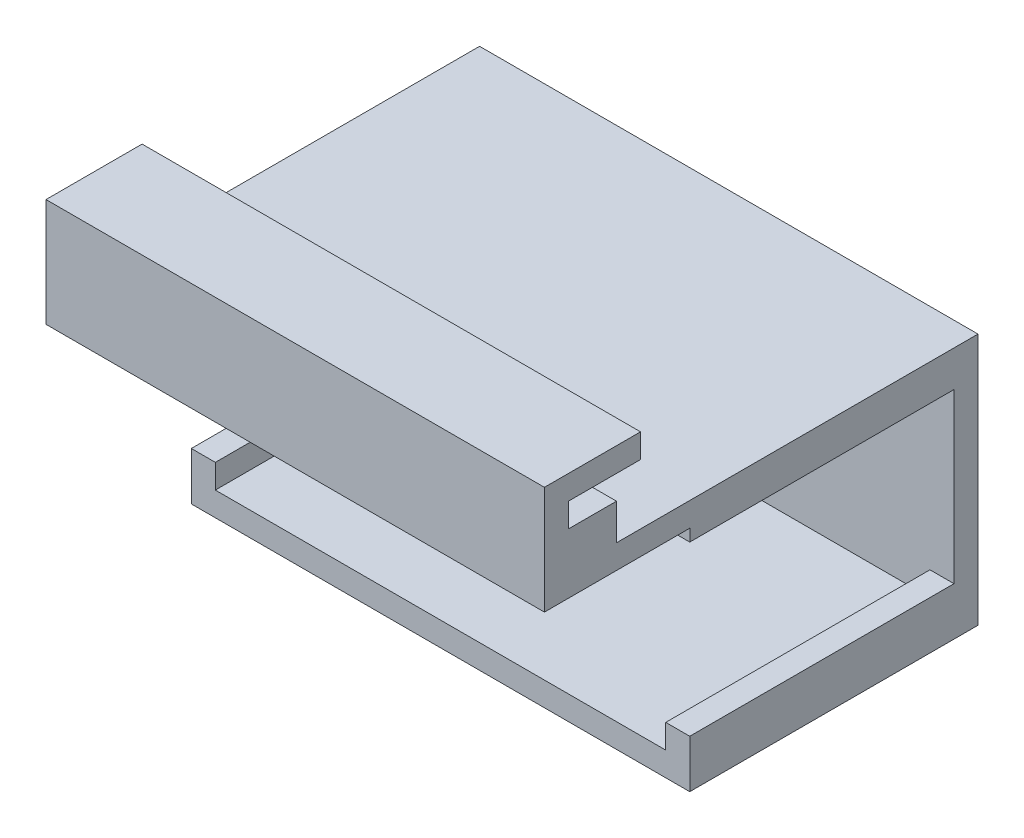
ISO-10303-21;
HEADER;
FILE_DESCRIPTION(('STEP AP214'),'2;1');
FILE_NAME('part.step','',(''),(''),'','','');
FILE_SCHEMA(('AUTOMOTIVE_DESIGN { 1 0 10303 214 1 1 1 1 }'));
ENDSEC;
DATA;
#1=APPLICATION_CONTEXT('core data for automotive mechanical design processes');
#2=APPLICATION_PROTOCOL_DEFINITION('international standard','automotive_design',2000,#1);
#3=PRODUCT_CONTEXT('',#1,'mechanical');
#4=PRODUCT('Part','Part','',(#3));
#5=PRODUCT_RELATED_PRODUCT_CATEGORY('part','',(#4));
#6=PRODUCT_DEFINITION_FORMATION('','',#4);
#7=PRODUCT_DEFINITION_CONTEXT('part definition',#1,'design');
#8=PRODUCT_DEFINITION('design','',#6,#7);
#9=PRODUCT_DEFINITION_SHAPE('','',#8);
#10=(LENGTH_UNIT() NAMED_UNIT(*) SI_UNIT(.MILLI.,.METRE.));
#11=(NAMED_UNIT(*) PLANE_ANGLE_UNIT() SI_UNIT($,.RADIAN.));
#12=(NAMED_UNIT(*) SI_UNIT($,.STERADIAN.) SOLID_ANGLE_UNIT());
#13=UNCERTAINTY_MEASURE_WITH_UNIT(LENGTH_MEASURE(1.E-05),#10,'distance_accuracy_value','');
#14=(GEOMETRIC_REPRESENTATION_CONTEXT(3) GLOBAL_UNCERTAINTY_ASSIGNED_CONTEXT((#13)) GLOBAL_UNIT_ASSIGNED_CONTEXT((#10,
#11,#12)) REPRESENTATION_CONTEXT('',''));
#15=CARTESIAN_POINT('',(0.,0.,0.));
#16=DIRECTION('',(0.,0.,1.));
#17=DIRECTION('',(1.,0.,0.));
#18=AXIS2_PLACEMENT_3D('',#15,#16,#17);
#19=CARTESIAN_POINT('',(-48.9395510953457,26.5034566253615,2.));
#20=DIRECTION('',(0.,-1.,0.));
#21=DIRECTION('',(0.,0.,-1.));
#22=AXIS2_PLACEMENT_3D('',#19,#20,#21);
#23=PLANE('',#22);
#24=DIRECTION('',(1.,0.,0.));
#25=VECTOR('',#24,1.);
#26=CARTESIAN_POINT('',(-49.9395510953457,26.5034566253615,30.1));
#27=LINE('',#26,#25);
#28=CARTESIAN_POINT('',(-49.9395510953457,26.5034566253615,30.1));
#29=VERTEX_POINT('',#28);
#30=CARTESIAN_POINT('',(-8.43955109534567,26.5034566253615,30.1));
#31=VERTEX_POINT('',#30);
#32=EDGE_CURVE('E211',#29,#31,#27,.T.);
#33=ORIENTED_EDGE('',*,*,#32,.T.);
#34=DIRECTION('',(0.,0.,-1.));
#35=VECTOR('',#34,1.);
#36=CARTESIAN_POINT('',(-8.43955109534567,26.5034566253615,2.));
#37=LINE('',#36,#35);
#38=CARTESIAN_POINT('',(-8.43955109534567,26.5034566253615,0.));
#39=VERTEX_POINT('',#38);
#40=EDGE_CURVE('E356',#31,#39,#37,.T.);
#41=ORIENTED_EDGE('',*,*,#40,.T.);
#42=DIRECTION('',(-1.,0.,0.));
#43=VECTOR('',#42,1.);
#44=CARTESIAN_POINT('',(-48.9395510953457,26.5034566253615,0.));
#45=LINE('',#44,#43);
#46=CARTESIAN_POINT('',(-49.9395510953457,26.5034566253615,0.));
#47=VERTEX_POINT('',#46);
#48=EDGE_CURVE('E353',#39,#47,#45,.T.);
#49=ORIENTED_EDGE('',*,*,#48,.T.);
#50=DIRECTION('',(0.,0.,-1.));
#51=VECTOR('',#50,1.);
#52=CARTESIAN_POINT('',(-49.9395510953457,26.5034566253615,2.));
#53=LINE('',#52,#51);
#54=EDGE_CURVE('E364',#29,#47,#53,.T.);
#55=ORIENTED_EDGE('',*,*,#54,.F.);
#56=EDGE_LOOP('',(#33,#41,#49,#55));
#57=FACE_BOUND('',#56,.T.);
#58=ADVANCED_FACE('F32',(#57),#23,.F.);
#59=CARTESIAN_POINT('',(0.,0.,24.));
#60=DIRECTION('',(0.,0.,1.));
#61=DIRECTION('',(1.,0.,0.));
#62=AXIS2_PLACEMENT_3D('',#59,#60,#61);
#63=PLANE('',#62);
#64=DIRECTION('',(0.,1.,0.));
#65=VECTOR('',#64,1.);
#66=CARTESIAN_POINT('',(-8.43955109534567,6.50345662536146,24.));
#67=LINE('',#66,#65);
#68=CARTESIAN_POINT('',(-8.43955109534567,23.5034566253615,24.));
#69=VERTEX_POINT('',#68);
#70=CARTESIAN_POINT('',(-8.43955109534567,24.5034566253615,24.));
#71=VERTEX_POINT('',#70);
#72=EDGE_CURVE('E326',#69,#71,#67,.T.);
#73=ORIENTED_EDGE('',*,*,#72,.T.);
#74=DIRECTION('',(-1.,0.,0.));
#75=VECTOR('',#74,1.);
#76=CARTESIAN_POINT('',(0.,24.5034566253615,24.));
#77=LINE('',#76,#75);
#78=CARTESIAN_POINT('',(-10.4395510953457,24.5034566253615,24.));
#79=VERTEX_POINT('',#78);
#80=EDGE_CURVE('E258',#71,#79,#77,.T.);
#81=ORIENTED_EDGE('',*,*,#80,.T.);
#82=DIRECTION('',(0.,1.,0.));
#83=VECTOR('',#82,1.);
#84=CARTESIAN_POINT('',(-10.4395510953457,8.50345662536146,24.));
#85=LINE('',#84,#83);
#86=CARTESIAN_POINT('',(-10.4395510953457,23.5034566253615,24.));
#87=VERTEX_POINT('',#86);
#88=EDGE_CURVE('E306',#87,#79,#85,.T.);
#89=ORIENTED_EDGE('',*,*,#88,.F.);
#90=DIRECTION('',(-1.,0.,0.));
#91=VECTOR('',#90,1.);
#92=CARTESIAN_POINT('',(0.,23.5034566253615,24.));
#93=LINE('',#92,#91);
#94=EDGE_CURVE('E283',#69,#87,#93,.T.);
#95=ORIENTED_EDGE('',*,*,#94,.F.);
#96=EDGE_LOOP('',(#73,#81,#89,#95));
#97=FACE_BOUND('',#96,.T.);
#98=ADVANCED_FACE('F394',(#97),#63,.T.);
#99=DIRECTION('',(0.,-1.,0.));
#100=VECTOR('',#99,1.);
#101=CARTESIAN_POINT('',(-47.9395510953457,7.50345662536146,24.));
#102=LINE('',#101,#100);
#103=CARTESIAN_POINT('',(-47.9395510953457,24.5034566253615,24.));
#104=VERTEX_POINT('',#103);
#105=CARTESIAN_POINT('',(-47.9395510953457,23.5034566253615,24.));
#106=VERTEX_POINT('',#105);
#107=EDGE_CURVE('E301',#104,#106,#102,.T.);
#108=ORIENTED_EDGE('',*,*,#107,.F.);
#109=CARTESIAN_POINT('',(-49.9395510953457,24.5034566253615,24.));
#110=VERTEX_POINT('',#109);
#111=EDGE_CURVE('E55',#104,#110,#77,.T.);
#112=ORIENTED_EDGE('',*,*,#111,.T.);
#113=DIRECTION('',(0.,-1.,0.));
#114=VECTOR('',#113,1.);
#115=CARTESIAN_POINT('',(-49.9395510953457,5.50345662536146,24.));
#116=LINE('',#115,#114);
#117=CARTESIAN_POINT('',(-49.9395510953457,23.5034566253615,24.));
#118=VERTEX_POINT('',#117);
#119=EDGE_CURVE('E321',#110,#118,#116,.T.);
#120=ORIENTED_EDGE('',*,*,#119,.T.);
#121=EDGE_CURVE('E286',#106,#118,#93,.T.);
#122=ORIENTED_EDGE('',*,*,#121,.F.);
#123=EDGE_LOOP('',(#108,#112,#120,#122));
#124=FACE_BOUND('',#123,.T.);
#125=ADVANCED_FACE('F399',(#124),#63,.T.);
#126=CARTESIAN_POINT('',(-47.9395510953457,7.50345662536146,24.));
#127=DIRECTION('',(1.,0.,0.));
#128=DIRECTION('',(0.,0.,-1.));
#129=AXIS2_PLACEMENT_3D('',#126,#127,#128);
#130=PLANE('',#129);
#131=DIRECTION('',(0.,0.,1.));
#132=VECTOR('',#131,1.);
#133=CARTESIAN_POINT('',(-47.9395510953457,23.5034566253615,24.));
#134=LINE('',#133,#132);
#135=CARTESIAN_POINT('',(-47.9395510953457,23.5034566253615,2.));
#136=VERTEX_POINT('',#135);
#137=EDGE_CURVE('E289',#136,#106,#134,.T.);
#138=ORIENTED_EDGE('',*,*,#137,.F.);
#139=DIRECTION('',(0.,1.,0.));
#140=VECTOR('',#139,1.);
#141=CARTESIAN_POINT('',(-47.9395510953457,0.,2.));
#142=LINE('',#141,#140);
#143=CARTESIAN_POINT('',(-47.9395510953457,24.5034566253615,2.));
#144=VERTEX_POINT('',#143);
#145=EDGE_CURVE('E340',#136,#144,#142,.T.);
#146=ORIENTED_EDGE('',*,*,#145,.T.);
#147=DIRECTION('',(0.,0.,-1.));
#148=VECTOR('',#147,1.);
#149=CARTESIAN_POINT('',(-47.9395510953457,24.5034566253615,24.));
#150=LINE('',#149,#148);
#151=EDGE_CURVE('E318',#104,#144,#150,.T.);
#152=ORIENTED_EDGE('',*,*,#151,.F.);
#153=ORIENTED_EDGE('',*,*,#107,.T.);
#154=EDGE_LOOP('',(#138,#146,#152,#153));
#155=FACE_BOUND('',#154,.T.);
#156=ADVANCED_FACE('F416',(#155),#130,.T.);
#157=CARTESIAN_POINT('',(-10.4395510953457,8.50345662536146,24.));
#158=DIRECTION('',(-1.,0.,0.));
#159=DIRECTION('',(0.,-1.,0.));
#160=AXIS2_PLACEMENT_3D('',#157,#158,#159);
#161=PLANE('',#160);
#162=DIRECTION('',(0.,0.,-1.));
#163=VECTOR('',#162,1.);
#164=CARTESIAN_POINT('',(-10.4395510953457,23.5034566253615,24.));
#165=LINE('',#164,#163);
#166=CARTESIAN_POINT('',(-10.4395510953457,23.5034566253615,2.));
#167=VERTEX_POINT('',#166);
#168=EDGE_CURVE('E281',#87,#167,#165,.T.);
#169=ORIENTED_EDGE('',*,*,#168,.F.);
#170=ORIENTED_EDGE('',*,*,#88,.T.);
#171=DIRECTION('',(0.,0.,-1.));
#172=VECTOR('',#171,1.);
#173=CARTESIAN_POINT('',(-10.4395510953457,24.5034566253615,24.));
#174=LINE('',#173,#172);
#175=CARTESIAN_POINT('',(-10.4395510953457,24.5034566253615,2.));
#176=VERTEX_POINT('',#175);
#177=EDGE_CURVE('E310',#79,#176,#174,.T.);
#178=ORIENTED_EDGE('',*,*,#177,.T.);
#179=DIRECTION('',(0.,-1.,0.));
#180=VECTOR('',#179,1.);
#181=CARTESIAN_POINT('',(-10.4395510953457,0.,2.));
#182=LINE('',#181,#180);
#183=EDGE_CURVE('E334',#176,#167,#182,.T.);
#184=ORIENTED_EDGE('',*,*,#183,.T.);
#185=EDGE_LOOP('',(#169,#170,#178,#184));
#186=FACE_BOUND('',#185,.T.);
#187=ADVANCED_FACE('F424',(#186),#161,.T.);
#188=CARTESIAN_POINT('',(-49.9395510953457,26.5034566253615,2.));
#189=DIRECTION('',(1.,0.,0.));
#190=DIRECTION('',(0.,0.,-1.));
#191=AXIS2_PLACEMENT_3D('',#188,#189,#190);
#192=PLANE('',#191);
#193=DIRECTION('',(0.,1.,0.));
#194=VECTOR('',#193,1.);
#195=CARTESIAN_POINT('',(-49.9395510953457,24.5034566253615,36.1));
#196=LINE('',#195,#194);
#197=CARTESIAN_POINT('',(-49.9395510953457,24.5034566253615,36.1));
#198=VERTEX_POINT('',#197);
#199=CARTESIAN_POINT('',(-49.9395510953457,33.5034566253615,36.1));
#200=VERTEX_POINT('',#199);
#201=EDGE_CURVE('E254',#198,#200,#196,.T.);
#202=ORIENTED_EDGE('',*,*,#201,.T.);
#203=DIRECTION('',(0.,0.,1.));
#204=VECTOR('',#203,1.);
#205=CARTESIAN_POINT('',(-49.9395510953457,33.5034566253615,34.1));
#206=LINE('',#205,#204);
#207=CARTESIAN_POINT('',(-49.9395510953457,33.5034566253615,28.1));
#208=VERTEX_POINT('',#207);
#209=EDGE_CURVE('E243',#208,#200,#206,.T.);
#210=ORIENTED_EDGE('',*,*,#209,.F.);
#211=DIRECTION('',(0.,-1.,0.));
#212=VECTOR('',#211,1.);
#213=CARTESIAN_POINT('',(-49.9395510953457,31.5034566253615,28.1));
#214=LINE('',#213,#212);
#215=CARTESIAN_POINT('',(-49.9395510953457,31.5034566253615,28.1));
#216=VERTEX_POINT('',#215);
#217=EDGE_CURVE('E219',#208,#216,#214,.T.);
#218=ORIENTED_EDGE('',*,*,#217,.T.);
#219=DIRECTION('',(0.,0.,1.));
#220=VECTOR('',#219,1.);
#221=CARTESIAN_POINT('',(-49.9395510953457,31.5034566253615,28.1));
#222=LINE('',#221,#220);
#223=CARTESIAN_POINT('',(-49.9395510953457,31.5034566253615,34.1));
#224=VERTEX_POINT('',#223);
#225=EDGE_CURVE('E232',#216,#224,#222,.T.);
#226=ORIENTED_EDGE('',*,*,#225,.T.);
#227=DIRECTION('',(0.,-1.,0.));
#228=VECTOR('',#227,1.);
#229=CARTESIAN_POINT('',(-49.9395510953457,24.5034566253615,34.1));
#230=LINE('',#229,#228);
#231=CARTESIAN_POINT('',(-49.9395510953457,29.5034566253615,34.1));
#232=VERTEX_POINT('',#231);
#233=EDGE_CURVE('E199',#224,#232,#230,.T.);
#234=ORIENTED_EDGE('',*,*,#233,.T.);
#235=DIRECTION('',(0.,0.,1.));
#236=VECTOR('',#235,1.);
#237=CARTESIAN_POINT('',(-49.9395510953457,29.5034566253615,30.1));
#238=LINE('',#237,#236);
#239=CARTESIAN_POINT('',(-49.9395510953457,29.5034566253615,30.1));
#240=VERTEX_POINT('',#239);
#241=EDGE_CURVE('E194',#240,#232,#238,.T.);
#242=ORIENTED_EDGE('',*,*,#241,.F.);
#243=DIRECTION('',(0.,-1.,0.));
#244=VECTOR('',#243,1.);
#245=CARTESIAN_POINT('',(-49.9395510953457,29.5034566253615,30.1));
#246=LINE('',#245,#244);
#247=EDGE_CURVE('E196',#240,#29,#246,.T.);
#248=ORIENTED_EDGE('',*,*,#247,.T.);
#249=ORIENTED_EDGE('',*,*,#54,.T.);
#250=DIRECTION('',(0.,-1.,0.));
#251=VECTOR('',#250,1.);
#252=CARTESIAN_POINT('',(-49.9395510953457,26.5034566253615,0.));
#253=LINE('',#252,#251);
#254=CARTESIAN_POINT('',(-49.9395510953457,5.50345662536146,0.));
#255=VERTEX_POINT('',#254);
#256=EDGE_CURVE('E344',#47,#255,#253,.T.);
#257=ORIENTED_EDGE('',*,*,#256,.T.);
#258=DIRECTION('',(0.,0.,-1.));
#259=VECTOR('',#258,1.);
#260=CARTESIAN_POINT('',(-49.9395510953457,5.50345662536146,2.));
#261=LINE('',#260,#259);
#262=CARTESIAN_POINT('',(-49.9395510953457,5.50345662536146,24.));
#263=VERTEX_POINT('',#262);
#264=EDGE_CURVE('E361',#263,#255,#261,.T.);
#265=ORIENTED_EDGE('',*,*,#264,.F.);
#266=CARTESIAN_POINT('',(-49.9395510953457,9.50345662536146,24.));
#267=VERTEX_POINT('',#266);
#268=EDGE_CURVE('E320',#267,#263,#116,.T.);
#269=ORIENTED_EDGE('',*,*,#268,.F.);
#270=DIRECTION('',(0.,0.,-1.));
#271=VECTOR('',#270,1.);
#272=CARTESIAN_POINT('',(-49.9395510953457,9.50345662536146,2.));
#273=LINE('',#272,#271);
#274=CARTESIAN_POINT('',(-49.9395510953457,9.50345662536146,2.));
#275=VERTEX_POINT('',#274);
#276=EDGE_CURVE('E278',#267,#275,#273,.T.);
#277=ORIENTED_EDGE('',*,*,#276,.T.);
#278=DIRECTION('',(0.,1.,0.));
#279=VECTOR('',#278,1.);
#280=CARTESIAN_POINT('',(-49.9395510953457,26.5034566253615,2.));
#281=LINE('',#280,#279);
#282=CARTESIAN_POINT('',(-49.9395510953457,23.5034566253615,2.));
#283=VERTEX_POINT('',#282);
#284=EDGE_CURVE('E297',#275,#283,#281,.T.);
#285=ORIENTED_EDGE('',*,*,#284,.T.);
#286=DIRECTION('',(0.,0.,1.));
#287=VECTOR('',#286,1.);
#288=CARTESIAN_POINT('',(-49.9395510953457,23.5034566253615,2.));
#289=LINE('',#288,#287);
#290=EDGE_CURVE('E291',#283,#118,#289,.T.);
#291=ORIENTED_EDGE('',*,*,#290,.T.);
#292=ORIENTED_EDGE('',*,*,#119,.F.);
#293=DIRECTION('',(0.,0.,1.));
#294=VECTOR('',#293,1.);
#295=CARTESIAN_POINT('',(-49.9395510953457,24.5034566253615,20.6071928872946));
#296=LINE('',#295,#294);
#297=EDGE_CURVE('E246',#110,#198,#296,.T.);
#298=ORIENTED_EDGE('',*,*,#297,.T.);
#299=EDGE_LOOP('',(#202,#210,#218,#226,#234,#242,#248,#249,#257,#265,#269,#277,#285,#291,#292,#298));
#300=FACE_BOUND('',#299,.T.);
#301=ADVANCED_FACE('F34',(#300),#192,.F.);
#302=CARTESIAN_POINT('',(-48.9395510953457,5.50345662536146,2.));
#303=DIRECTION('',(0.,1.,0.));
#304=DIRECTION('',(0.,0.,1.));
#305=AXIS2_PLACEMENT_3D('',#302,#303,#304);
#306=PLANE('',#305);
#307=DIRECTION('',(1.,0.,0.));
#308=VECTOR('',#307,1.);
#309=CARTESIAN_POINT('',(-48.9395510953457,5.50345662536146,0.));
#310=LINE('',#309,#308);
#311=CARTESIAN_POINT('',(-8.43955109534567,5.50345662536146,0.));
#312=VERTEX_POINT('',#311);
#313=EDGE_CURVE('E347',#255,#312,#310,.T.);
#314=ORIENTED_EDGE('',*,*,#313,.T.);
#315=DIRECTION('',(0.,0.,-1.));
#316=VECTOR('',#315,1.);
#317=CARTESIAN_POINT('',(-8.43955109534567,5.50345662536146,2.));
#318=LINE('',#317,#316);
#319=CARTESIAN_POINT('',(-8.43955109534567,5.50345662536146,24.));
#320=VERTEX_POINT('',#319);
#321=EDGE_CURVE('E358',#320,#312,#318,.T.);
#322=ORIENTED_EDGE('',*,*,#321,.F.);
#323=DIRECTION('',(1.,0.,0.));
#324=VECTOR('',#323,1.);
#325=CARTESIAN_POINT('',(-48.9395510953457,5.50345662536146,24.));
#326=LINE('',#325,#324);
#327=EDGE_CURVE('E323',#263,#320,#326,.T.);
#328=ORIENTED_EDGE('',*,*,#327,.F.);
#329=ORIENTED_EDGE('',*,*,#264,.T.);
#330=EDGE_LOOP('',(#314,#322,#328,#329));
#331=FACE_BOUND('',#330,.T.);
#332=ADVANCED_FACE('F382',(#331),#306,.F.);
#333=CARTESIAN_POINT('',(-8.43955109534567,6.50345662536146,2.));
#334=DIRECTION('',(-1.,0.,0.));
#335=DIRECTION('',(0.,0.,1.));
#336=AXIS2_PLACEMENT_3D('',#333,#334,#335);
#337=PLANE('',#336);
#338=DIRECTION('',(0.,0.,1.));
#339=VECTOR('',#338,1.);
#340=CARTESIAN_POINT('',(-8.43955109534567,33.5034566253615,34.1));
#341=LINE('',#340,#339);
#342=CARTESIAN_POINT('',(-8.43955109534567,33.5034566253615,28.1));
#343=VERTEX_POINT('',#342);
#344=CARTESIAN_POINT('',(-8.43955109534567,33.5034566253615,36.1));
#345=VERTEX_POINT('',#344);
#346=EDGE_CURVE('E240',#343,#345,#341,.T.);
#347=ORIENTED_EDGE('',*,*,#346,.T.);
#348=DIRECTION('',(0.,1.,0.));
#349=VECTOR('',#348,1.);
#350=CARTESIAN_POINT('',(-8.43955109534567,24.5034566253615,36.1));
#351=LINE('',#350,#349);
#352=CARTESIAN_POINT('',(-8.43955109534567,24.5034566253615,36.1));
#353=VERTEX_POINT('',#352);
#354=EDGE_CURVE('E255',#353,#345,#351,.T.);
#355=ORIENTED_EDGE('',*,*,#354,.F.);
#356=DIRECTION('',(0.,0.,-1.));
#357=VECTOR('',#356,1.);
#358=CARTESIAN_POINT('',(-8.43955109534567,24.5034566253615,36.1));
#359=LINE('',#358,#357);
#360=EDGE_CURVE('E252',#353,#71,#359,.T.);
#361=ORIENTED_EDGE('',*,*,#360,.T.);
#362=ORIENTED_EDGE('',*,*,#72,.F.);
#363=DIRECTION('',(0.,0.,-1.));
#364=VECTOR('',#363,1.);
#365=CARTESIAN_POINT('',(-8.43955109534567,23.5034566253615,2.));
#366=LINE('',#365,#364);
#367=CARTESIAN_POINT('',(-8.43955109534567,23.5034566253615,2.));
#368=VERTEX_POINT('',#367);
#369=EDGE_CURVE('E285',#69,#368,#366,.T.);
#370=ORIENTED_EDGE('',*,*,#369,.T.);
#371=DIRECTION('',(0.,-1.,0.));
#372=VECTOR('',#371,1.);
#373=CARTESIAN_POINT('',(-8.43955109534567,6.50345662536146,2.));
#374=LINE('',#373,#372);
#375=CARTESIAN_POINT('',(-8.43955109534567,9.50345662536146,2.));
#376=VERTEX_POINT('',#375);
#377=EDGE_CURVE('E294',#368,#376,#374,.T.);
#378=ORIENTED_EDGE('',*,*,#377,.T.);
#379=DIRECTION('',(0.,0.,1.));
#380=VECTOR('',#379,1.);
#381=CARTESIAN_POINT('',(-8.43955109534567,9.50345662536146,2.));
#382=LINE('',#381,#380);
#383=CARTESIAN_POINT('',(-8.43955109534567,9.50345662536146,24.));
#384=VERTEX_POINT('',#383);
#385=EDGE_CURVE('E272',#376,#384,#382,.T.);
#386=ORIENTED_EDGE('',*,*,#385,.T.);
#387=EDGE_CURVE('E327',#320,#384,#67,.T.);
#388=ORIENTED_EDGE('',*,*,#387,.F.);
#389=ORIENTED_EDGE('',*,*,#321,.T.);
#390=DIRECTION('',(0.,1.,0.));
#391=VECTOR('',#390,1.);
#392=CARTESIAN_POINT('',(-8.43955109534567,6.50345662536146,0.));
#393=LINE('',#392,#391);
#394=EDGE_CURVE('E350',#312,#39,#393,.T.);
#395=ORIENTED_EDGE('',*,*,#394,.T.);
#396=ORIENTED_EDGE('',*,*,#40,.F.);
#397=DIRECTION('',(0.,1.,0.));
#398=VECTOR('',#397,1.);
#399=CARTESIAN_POINT('',(-8.43955109534567,29.5034566253615,30.1));
#400=LINE('',#399,#398);
#401=CARTESIAN_POINT('',(-8.43955109534567,29.5034566253615,30.1));
#402=VERTEX_POINT('',#401);
#403=EDGE_CURVE('E204',#31,#402,#400,.T.);
#404=ORIENTED_EDGE('',*,*,#403,.T.);
#405=DIRECTION('',(0.,0.,1.));
#406=VECTOR('',#405,1.);
#407=CARTESIAN_POINT('',(-8.43955109534567,29.5034566253615,30.1));
#408=LINE('',#407,#406);
#409=CARTESIAN_POINT('',(-8.43955109534567,29.5034566253615,34.1));
#410=VERTEX_POINT('',#409);
#411=EDGE_CURVE('E203',#402,#410,#408,.T.);
#412=ORIENTED_EDGE('',*,*,#411,.T.);
#413=DIRECTION('',(0.,1.,0.));
#414=VECTOR('',#413,1.);
#415=CARTESIAN_POINT('',(-8.43955109534567,24.5034566253615,34.1));
#416=LINE('',#415,#414);
#417=CARTESIAN_POINT('',(-8.43955109534567,31.5034566253615,34.1));
#418=VERTEX_POINT('',#417);
#419=EDGE_CURVE('E47',#410,#418,#416,.T.);
#420=ORIENTED_EDGE('',*,*,#419,.T.);
#421=DIRECTION('',(0.,0.,1.));
#422=VECTOR('',#421,1.);
#423=CARTESIAN_POINT('',(-8.43955109534567,31.5034566253615,28.1));
#424=LINE('',#423,#422);
#425=CARTESIAN_POINT('',(-8.43955109534567,31.5034566253615,28.1));
#426=VERTEX_POINT('',#425);
#427=EDGE_CURVE('E233',#426,#418,#424,.T.);
#428=ORIENTED_EDGE('',*,*,#427,.F.);
#429=DIRECTION('',(0.,1.,0.));
#430=VECTOR('',#429,1.);
#431=CARTESIAN_POINT('',(-8.43955109534567,33.5034566253615,28.1));
#432=LINE('',#431,#430);
#433=EDGE_CURVE('E226',#426,#343,#432,.T.);
#434=ORIENTED_EDGE('',*,*,#433,.T.);
#435=EDGE_LOOP('',(#347,#355,#361,#362,#370,#378,#386,#388,#389,#395,#396,#404,#412,#420,#428,#434));
#436=FACE_BOUND('',#435,.T.);
#437=ADVANCED_FACE('F379',(#436),#337,.F.);
#438=CARTESIAN_POINT('',(0.,0.,0.));
#439=DIRECTION('',(0.,0.,1.));
#440=DIRECTION('',(1.,0.,0.));
#441=AXIS2_PLACEMENT_3D('',#438,#439,#440);
#442=PLANE('',#441);
#443=ORIENTED_EDGE('',*,*,#256,.F.);
#444=ORIENTED_EDGE('',*,*,#48,.F.);
#445=ORIENTED_EDGE('',*,*,#394,.F.);
#446=ORIENTED_EDGE('',*,*,#313,.F.);
#447=EDGE_LOOP('',(#443,#444,#445,#446));
#448=FACE_BOUND('',#447,.T.);
#449=ADVANCED_FACE('F381',(#448),#442,.F.);
#450=DIRECTION('',(1.,0.,0.));
#451=VECTOR('',#450,1.);
#452=CARTESIAN_POINT('',(0.,9.50345662536146,24.));
#453=LINE('',#452,#451);
#454=CARTESIAN_POINT('',(-47.9395510953457,9.50345662536146,24.));
#455=VERTEX_POINT('',#454);
#456=EDGE_CURVE('E273',#267,#455,#453,.T.);
#457=ORIENTED_EDGE('',*,*,#456,.F.);
#458=ORIENTED_EDGE('',*,*,#268,.T.);
#459=ORIENTED_EDGE('',*,*,#327,.T.);
#460=ORIENTED_EDGE('',*,*,#387,.T.);
#461=CARTESIAN_POINT('',(-10.4395510953457,9.50345662536146,24.));
#462=VERTEX_POINT('',#461);
#463=EDGE_CURVE('E270',#462,#384,#453,.T.);
#464=ORIENTED_EDGE('',*,*,#463,.F.);
#465=CARTESIAN_POINT('',(-10.4395510953457,7.50345662536146,24.));
#466=VERTEX_POINT('',#465);
#467=EDGE_CURVE('E307',#466,#462,#85,.T.);
#468=ORIENTED_EDGE('',*,*,#467,.F.);
#469=DIRECTION('',(1.,0.,0.));
#470=VECTOR('',#469,1.);
#471=CARTESIAN_POINT('',(-46.9395510953457,7.50345662536146,24.));
#472=LINE('',#471,#470);
#473=CARTESIAN_POINT('',(-47.9395510953457,7.50345662536146,24.));
#474=VERTEX_POINT('',#473);
#475=EDGE_CURVE('E304',#474,#466,#472,.T.);
#476=ORIENTED_EDGE('',*,*,#475,.F.);
#477=EDGE_CURVE('E300',#455,#474,#102,.T.);
#478=ORIENTED_EDGE('',*,*,#477,.F.);
#479=EDGE_LOOP('',(#457,#458,#459,#460,#464,#468,#476,#478));
#480=FACE_BOUND('',#479,.T.);
#481=ADVANCED_FACE('F388',(#480),#63,.T.);
#482=DIRECTION('',(0.,0.,-1.));
#483=VECTOR('',#482,1.);
#484=CARTESIAN_POINT('',(-47.9395510953457,9.50345662536146,24.));
#485=LINE('',#484,#483);
#486=CARTESIAN_POINT('',(-47.9395510953457,9.50345662536146,2.));
#487=VERTEX_POINT('',#486);
#488=EDGE_CURVE('E276',#455,#487,#485,.T.);
#489=ORIENTED_EDGE('',*,*,#488,.F.);
#490=ORIENTED_EDGE('',*,*,#477,.T.);
#491=DIRECTION('',(0.,0.,-1.));
#492=VECTOR('',#491,1.);
#493=CARTESIAN_POINT('',(-47.9395510953457,7.50345662536146,24.));
#494=LINE('',#493,#492);
#495=CARTESIAN_POINT('',(-47.9395510953457,7.50345662536146,2.));
#496=VERTEX_POINT('',#495);
#497=EDGE_CURVE('E315',#474,#496,#494,.T.);
#498=ORIENTED_EDGE('',*,*,#497,.T.);
#499=EDGE_CURVE('E341',#496,#487,#142,.T.);
#500=ORIENTED_EDGE('',*,*,#499,.T.);
#501=EDGE_LOOP('',(#489,#490,#498,#500));
#502=FACE_BOUND('',#501,.T.);
#503=ADVANCED_FACE('F410',(#502),#130,.T.);
#504=CARTESIAN_POINT('',(-46.9395510953457,7.50345662536146,24.));
#505=DIRECTION('',(0.,1.,0.));
#506=DIRECTION('',(0.,0.,1.));
#507=AXIS2_PLACEMENT_3D('',#504,#505,#506);
#508=PLANE('',#507);
#509=DIRECTION('',(0.,0.,-1.));
#510=VECTOR('',#509,1.);
#511=CARTESIAN_POINT('',(-10.4395510953457,7.50345662536146,24.));
#512=LINE('',#511,#510);
#513=CARTESIAN_POINT('',(-10.4395510953457,7.50345662536146,2.));
#514=VERTEX_POINT('',#513);
#515=EDGE_CURVE('E312',#466,#514,#512,.T.);
#516=ORIENTED_EDGE('',*,*,#515,.T.);
#517=DIRECTION('',(-1.,0.,0.));
#518=VECTOR('',#517,1.);
#519=CARTESIAN_POINT('',(0.,7.50345662536146,2.));
#520=LINE('',#519,#518);
#521=EDGE_CURVE('E337',#514,#496,#520,.T.);
#522=ORIENTED_EDGE('',*,*,#521,.T.);
#523=ORIENTED_EDGE('',*,*,#497,.F.);
#524=ORIENTED_EDGE('',*,*,#475,.T.);
#525=EDGE_LOOP('',(#516,#522,#523,#524));
#526=FACE_BOUND('',#525,.T.);
#527=ADVANCED_FACE('F414',(#526),#508,.T.);
#528=DIRECTION('',(0.,0.,1.));
#529=VECTOR('',#528,1.);
#530=CARTESIAN_POINT('',(-10.4395510953457,9.50345662536146,24.));
#531=LINE('',#530,#529);
#532=CARTESIAN_POINT('',(-10.4395510953457,9.50345662536146,2.));
#533=VERTEX_POINT('',#532);
#534=EDGE_CURVE('E268',#533,#462,#531,.T.);
#535=ORIENTED_EDGE('',*,*,#534,.F.);
#536=EDGE_CURVE('E333',#533,#514,#182,.T.);
#537=ORIENTED_EDGE('',*,*,#536,.T.);
#538=ORIENTED_EDGE('',*,*,#515,.F.);
#539=ORIENTED_EDGE('',*,*,#467,.T.);
#540=EDGE_LOOP('',(#535,#537,#538,#539));
#541=FACE_BOUND('',#540,.T.);
#542=ADVANCED_FACE('F419',(#541),#161,.T.);
#543=CARTESIAN_POINT('',(-46.9395510953457,24.5034566253615,24.));
#544=DIRECTION('',(0.,-1.,0.));
#545=DIRECTION('',(0.,0.,-1.));
#546=AXIS2_PLACEMENT_3D('',#543,#544,#545);
#547=PLANE('',#546);
#548=ORIENTED_EDGE('',*,*,#80,.F.);
#549=ORIENTED_EDGE('',*,*,#360,.F.);
#550=DIRECTION('',(1.,0.,0.));
#551=VECTOR('',#550,1.);
#552=CARTESIAN_POINT('',(-49.9395510953457,24.5034566253615,36.1));
#553=LINE('',#552,#551);
#554=EDGE_CURVE('E250',#198,#353,#553,.T.);
#555=ORIENTED_EDGE('',*,*,#554,.F.);
#556=ORIENTED_EDGE('',*,*,#297,.F.);
#557=ORIENTED_EDGE('',*,*,#111,.F.);
#558=ORIENTED_EDGE('',*,*,#151,.T.);
#559=DIRECTION('',(1.,0.,0.));
#560=VECTOR('',#559,1.);
#561=CARTESIAN_POINT('',(0.,24.5034566253615,2.));
#562=LINE('',#561,#560);
#563=EDGE_CURVE('E330',#144,#176,#562,.T.);
#564=ORIENTED_EDGE('',*,*,#563,.T.);
#565=ORIENTED_EDGE('',*,*,#177,.F.);
#566=EDGE_LOOP('',(#548,#549,#555,#556,#557,#558,#564,#565));
#567=FACE_BOUND('',#566,.T.);
#568=ADVANCED_FACE('F406',(#567),#547,.T.);
#569=CARTESIAN_POINT('',(0.,0.,2.));
#570=DIRECTION('',(0.,0.,1.));
#571=DIRECTION('',(1.,0.,0.));
#572=AXIS2_PLACEMENT_3D('',#569,#570,#571);
#573=PLANE('',#572);
#574=ORIENTED_EDGE('',*,*,#536,.F.);
#575=DIRECTION('',(1.,0.,0.));
#576=VECTOR('',#575,1.);
#577=CARTESIAN_POINT('',(-70.1,9.50345662536146,2.));
#578=LINE('',#577,#576);
#579=EDGE_CURVE('E260',#533,#376,#578,.T.);
#580=ORIENTED_EDGE('',*,*,#579,.T.);
#581=ORIENTED_EDGE('',*,*,#377,.F.);
#582=DIRECTION('',(1.,0.,0.));
#583=VECTOR('',#582,1.);
#584=CARTESIAN_POINT('',(-70.1,23.5034566253615,2.));
#585=LINE('',#584,#583);
#586=EDGE_CURVE('E261',#167,#368,#585,.T.);
#587=ORIENTED_EDGE('',*,*,#586,.F.);
#588=ORIENTED_EDGE('',*,*,#183,.F.);
#589=ORIENTED_EDGE('',*,*,#563,.F.);
#590=ORIENTED_EDGE('',*,*,#145,.F.);
#591=EDGE_CURVE('E264',#283,#136,#585,.T.);
#592=ORIENTED_EDGE('',*,*,#591,.F.);
#593=ORIENTED_EDGE('',*,*,#284,.F.);
#594=EDGE_CURVE('E265',#275,#487,#578,.T.);
#595=ORIENTED_EDGE('',*,*,#594,.T.);
#596=ORIENTED_EDGE('',*,*,#499,.F.);
#597=ORIENTED_EDGE('',*,*,#521,.F.);
#598=EDGE_LOOP('',(#574,#580,#581,#587,#588,#589,#590,#592,#593,#595,#596,#597));
#599=FACE_BOUND('',#598,.T.);
#600=ADVANCED_FACE('F403',(#599),#573,.T.);
#601=CARTESIAN_POINT('',(-70.1,9.50345662536146,2.));
#602=DIRECTION('',(0.,-1.,0.));
#603=DIRECTION('',(0.,0.,-1.));
#604=AXIS2_PLACEMENT_3D('',#601,#602,#603);
#605=PLANE('',#604);
#606=ORIENTED_EDGE('',*,*,#579,.F.);
#607=ORIENTED_EDGE('',*,*,#534,.T.);
#608=ORIENTED_EDGE('',*,*,#463,.T.);
#609=ORIENTED_EDGE('',*,*,#385,.F.);
#610=EDGE_LOOP('',(#606,#607,#608,#609));
#611=FACE_BOUND('',#610,.T.);
#612=ADVANCED_FACE('F405',(#611),#605,.F.);
#613=CARTESIAN_POINT('',(-70.1,23.5034566253615,2.));
#614=DIRECTION('',(0.,1.,0.));
#615=DIRECTION('',(0.,0.,1.));
#616=AXIS2_PLACEMENT_3D('',#613,#614,#615);
#617=PLANE('',#616);
#618=ORIENTED_EDGE('',*,*,#94,.T.);
#619=ORIENTED_EDGE('',*,*,#168,.T.);
#620=ORIENTED_EDGE('',*,*,#586,.T.);
#621=ORIENTED_EDGE('',*,*,#369,.F.);
#622=EDGE_LOOP('',(#618,#619,#620,#621));
#623=FACE_BOUND('',#622,.T.);
#624=ADVANCED_FACE('F436',(#623),#617,.F.);
#625=ORIENTED_EDGE('',*,*,#591,.T.);
#626=ORIENTED_EDGE('',*,*,#137,.T.);
#627=ORIENTED_EDGE('',*,*,#121,.T.);
#628=ORIENTED_EDGE('',*,*,#290,.F.);
#629=EDGE_LOOP('',(#625,#626,#627,#628));
#630=FACE_BOUND('',#629,.T.);
#631=ADVANCED_FACE('F432',(#630),#617,.F.);
#632=ORIENTED_EDGE('',*,*,#456,.T.);
#633=ORIENTED_EDGE('',*,*,#488,.T.);
#634=ORIENTED_EDGE('',*,*,#594,.F.);
#635=ORIENTED_EDGE('',*,*,#276,.F.);
#636=EDGE_LOOP('',(#632,#633,#634,#635));
#637=FACE_BOUND('',#636,.T.);
#638=ADVANCED_FACE('F428',(#637),#605,.F.);
#639=CARTESIAN_POINT('',(-48.9395510953457,24.5034566253615,36.1));
#640=DIRECTION('',(0.,0.,1.));
#641=DIRECTION('',(1.,0.,0.));
#642=AXIS2_PLACEMENT_3D('',#639,#640,#641);
#643=PLANE('',#642);
#644=ORIENTED_EDGE('',*,*,#354,.T.);
#645=DIRECTION('',(-1.,0.,0.));
#646=VECTOR('',#645,1.);
#647=CARTESIAN_POINT('',(-49.9395510953457,33.5034566253615,36.1));
#648=LINE('',#647,#646);
#649=EDGE_CURVE('E236',#345,#200,#648,.T.);
#650=ORIENTED_EDGE('',*,*,#649,.T.);
#651=ORIENTED_EDGE('',*,*,#201,.F.);
#652=ORIENTED_EDGE('',*,*,#554,.T.);
#653=EDGE_LOOP('',(#644,#650,#651,#652));
#654=FACE_BOUND('',#653,.T.);
#655=ADVANCED_FACE('F431',(#654),#643,.T.);
#656=CARTESIAN_POINT('',(0.,0.,34.1));
#657=DIRECTION('',(0.,0.,-1.));
#658=DIRECTION('',(-1.,0.,0.));
#659=AXIS2_PLACEMENT_3D('',#656,#657,#658);
#660=PLANE('',#659);
#661=DIRECTION('',(1.,0.,0.));
#662=VECTOR('',#661,1.);
#663=CARTESIAN_POINT('',(0.,29.5034566253615,34.1));
#664=LINE('',#663,#662);
#665=EDGE_CURVE('E11',#232,#410,#664,.T.);
#666=ORIENTED_EDGE('',*,*,#665,.F.);
#667=ORIENTED_EDGE('',*,*,#233,.F.);
#668=DIRECTION('',(-1.,0.,0.));
#669=VECTOR('',#668,1.);
#670=CARTESIAN_POINT('',(0.,31.5034566253615,34.1));
#671=LINE('',#670,#669);
#672=EDGE_CURVE('E40',#418,#224,#671,.T.);
#673=ORIENTED_EDGE('',*,*,#672,.F.);
#674=ORIENTED_EDGE('',*,*,#419,.F.);
#675=EDGE_LOOP('',(#666,#667,#673,#674));
#676=FACE_BOUND('',#675,.T.);
#677=ADVANCED_FACE('F440',(#676),#660,.T.);
#678=CARTESIAN_POINT('',(-49.9395510953457,33.5034566253615,34.1));
#679=DIRECTION('',(0.,1.,0.));
#680=DIRECTION('',(0.,0.,1.));
#681=AXIS2_PLACEMENT_3D('',#678,#679,#680);
#682=PLANE('',#681);
#683=ORIENTED_EDGE('',*,*,#649,.F.);
#684=ORIENTED_EDGE('',*,*,#346,.F.);
#685=DIRECTION('',(-1.,0.,0.));
#686=VECTOR('',#685,1.);
#687=CARTESIAN_POINT('',(-49.9395510953457,33.5034566253615,28.1));
#688=LINE('',#687,#686);
#689=EDGE_CURVE('E229',#343,#208,#688,.T.);
#690=ORIENTED_EDGE('',*,*,#689,.T.);
#691=ORIENTED_EDGE('',*,*,#209,.T.);
#692=EDGE_LOOP('',(#683,#684,#690,#691));
#693=FACE_BOUND('',#692,.T.);
#694=ADVANCED_FACE('F377',(#693),#682,.T.);
#695=CARTESIAN_POINT('',(-8.43955109534567,31.5034566253615,28.1));
#696=DIRECTION('',(0.,-1.,0.));
#697=DIRECTION('',(0.,0.,-1.));
#698=AXIS2_PLACEMENT_3D('',#695,#696,#697);
#699=PLANE('',#698);
#700=ORIENTED_EDGE('',*,*,#427,.T.);
#701=ORIENTED_EDGE('',*,*,#672,.T.);
#702=ORIENTED_EDGE('',*,*,#225,.F.);
#703=DIRECTION('',(1.,0.,0.));
#704=VECTOR('',#703,1.);
#705=CARTESIAN_POINT('',(-8.43955109534567,31.5034566253615,28.1));
#706=LINE('',#705,#704);
#707=EDGE_CURVE('E223',#216,#426,#706,.T.);
#708=ORIENTED_EDGE('',*,*,#707,.T.);
#709=EDGE_LOOP('',(#700,#701,#702,#708));
#710=FACE_BOUND('',#709,.T.);
#711=ADVANCED_FACE('F367',(#710),#699,.T.);
#712=CARTESIAN_POINT('',(0.,0.,28.1));
#713=DIRECTION('',(0.,0.,-1.));
#714=DIRECTION('',(-1.,0.,0.));
#715=AXIS2_PLACEMENT_3D('',#712,#713,#714);
#716=PLANE('',#715);
#717=ORIENTED_EDGE('',*,*,#217,.F.);
#718=ORIENTED_EDGE('',*,*,#689,.F.);
#719=ORIENTED_EDGE('',*,*,#433,.F.);
#720=ORIENTED_EDGE('',*,*,#707,.F.);
#721=EDGE_LOOP('',(#717,#718,#719,#720));
#722=FACE_BOUND('',#721,.T.);
#723=ADVANCED_FACE('F373',(#722),#716,.T.);
#724=CARTESIAN_POINT('',(-49.715027182508,29.5034566253615,30.1));
#725=DIRECTION('',(0.,1.,0.));
#726=DIRECTION('',(0.,0.,1.));
#727=AXIS2_PLACEMENT_3D('',#724,#725,#726);
#728=PLANE('',#727);
#729=ORIENTED_EDGE('',*,*,#241,.T.);
#730=ORIENTED_EDGE('',*,*,#665,.T.);
#731=ORIENTED_EDGE('',*,*,#411,.F.);
#732=DIRECTION('',(-1.,0.,0.));
#733=VECTOR('',#732,1.);
#734=CARTESIAN_POINT('',(-49.715027182508,29.5034566253615,30.1));
#735=LINE('',#734,#733);
#736=EDGE_CURVE('E208',#402,#240,#735,.T.);
#737=ORIENTED_EDGE('',*,*,#736,.T.);
#738=EDGE_LOOP('',(#729,#730,#731,#737));
#739=FACE_BOUND('',#738,.T.);
#740=ADVANCED_FACE('F213',(#739),#728,.T.);
#741=CARTESIAN_POINT('',(0.,0.,30.1));
#742=DIRECTION('',(0.,0.,1.));
#743=DIRECTION('',(1.,0.,0.));
#744=AXIS2_PLACEMENT_3D('',#741,#742,#743);
#745=PLANE('',#744);
#746=ORIENTED_EDGE('',*,*,#736,.F.);
#747=ORIENTED_EDGE('',*,*,#403,.F.);
#748=ORIENTED_EDGE('',*,*,#32,.F.);
#749=ORIENTED_EDGE('',*,*,#247,.F.);
#750=EDGE_LOOP('',(#746,#747,#748,#749));
#751=FACE_BOUND('',#750,.T.);
#752=ADVANCED_FACE('F207',(#751),#745,.F.);
#753=CLOSED_SHELL('',(#58,#98,#125,#156,#187,#301,#332,#437,#449,#481,#503,#527,#542,#568,#600,
#612,#624,#631,#638,#655,#677,#694,#711,#723,#740,#752));
#754=MANIFOLD_SOLID_BREP('B2',#753);
#755=ADVANCED_BREP_SHAPE_REPRESENTATION('',(#18,#754),#14);
#756=SHAPE_DEFINITION_REPRESENTATION(#9,#755);
ENDSEC;
END-ISO-10303-21;
